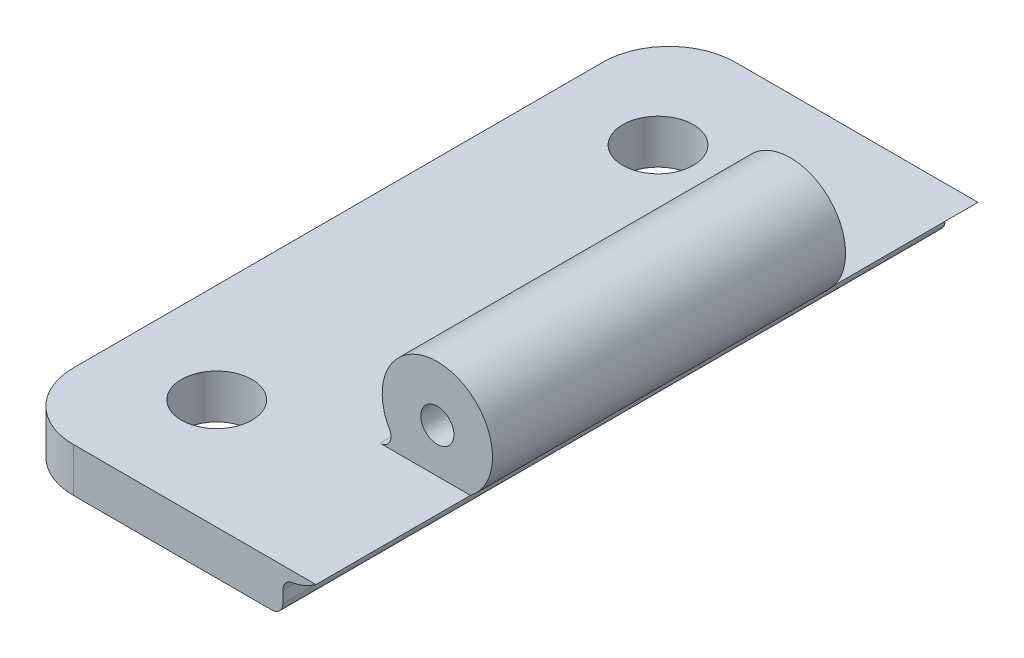
ISO-10303-21;
HEADER;
FILE_DESCRIPTION(('STEP AP214'),'2;1');
FILE_NAME('part.step','',(''),(''),'','','');
FILE_SCHEMA(('AUTOMOTIVE_DESIGN { 1 0 10303 214 1 1 1 1 }'));
ENDSEC;
DATA;
#1=APPLICATION_CONTEXT('core data for automotive mechanical design processes');
#2=APPLICATION_PROTOCOL_DEFINITION('international standard','automotive_design',2000,#1);
#3=PRODUCT_CONTEXT('',#1,'mechanical');
#4=PRODUCT('Part','Part','',(#3));
#5=PRODUCT_RELATED_PRODUCT_CATEGORY('part','',(#4));
#6=PRODUCT_DEFINITION_FORMATION('','',#4);
#7=PRODUCT_DEFINITION_CONTEXT('part definition',#1,'design');
#8=PRODUCT_DEFINITION('design','',#6,#7);
#9=PRODUCT_DEFINITION_SHAPE('','',#8);
#10=(LENGTH_UNIT() NAMED_UNIT(*) SI_UNIT(.MILLI.,.METRE.));
#11=(NAMED_UNIT(*) PLANE_ANGLE_UNIT() SI_UNIT($,.RADIAN.));
#12=(NAMED_UNIT(*) SI_UNIT($,.STERADIAN.) SOLID_ANGLE_UNIT());
#13=UNCERTAINTY_MEASURE_WITH_UNIT(LENGTH_MEASURE(1.E-05),#10,'distance_accuracy_value','');
#14=(GEOMETRIC_REPRESENTATION_CONTEXT(3) GLOBAL_UNCERTAINTY_ASSIGNED_CONTEXT((#13)) GLOBAL_UNIT_ASSIGNED_CONTEXT((#10,
#11,#12)) REPRESENTATION_CONTEXT('',''));
#15=CARTESIAN_POINT('',(0.,0.,0.));
#16=DIRECTION('',(0.,0.,1.));
#17=DIRECTION('',(1.,0.,0.));
#18=AXIS2_PLACEMENT_3D('',#15,#16,#17);
#19=CARTESIAN_POINT('',(3.00000000000002,2.,0.));
#20=DIRECTION('',(0.,0.,1.));
#21=DIRECTION('',(1.,0.,0.));
#22=AXIS2_PLACEMENT_3D('',#19,#20,#21);
#23=PLANE('',#22);
#24=DIRECTION('',(-1.,0.,0.));
#25=VECTOR('',#24,1.);
#26=CARTESIAN_POINT('',(3.00000000000002,2.,0.));
#27=LINE('',#26,#25);
#28=CARTESIAN_POINT('',(14.,2.,0.));
#29=VERTEX_POINT('',#28);
#30=CARTESIAN_POINT('',(3.00000000000002,2.,0.));
#31=VERTEX_POINT('',#30);
#32=EDGE_CURVE('E208',#29,#31,#27,.T.);
#33=ORIENTED_EDGE('',*,*,#32,.F.);
#34=CARTESIAN_POINT('',(12.5,4.,0.));
#35=DIRECTION('',(0.,0.,1.));
#36=DIRECTION('',(1.,0.,0.));
#37=AXIS2_PLACEMENT_3D('',#34,#35,#36);
#38=CIRCLE('',#37,2.5);
#39=CARTESIAN_POINT('',(12.9166666666667,1.53496675704183,0.));
#40=VERTEX_POINT('',#39);
#41=EDGE_CURVE('E193',#29,#40,#38,.F.);
#42=ORIENTED_EDGE('',*,*,#41,.T.);
#43=CARTESIAN_POINT('',(13.,1.04196010845019,0.));
#44=DIRECTION('',(0.,0.,1.));
#45=DIRECTION('',(1.,0.,0.));
#46=AXIS2_PLACEMENT_3D('',#43,#44,#45);
#47=CIRCLE('',#46,0.5);
#48=CARTESIAN_POINT('',(12.5,1.04196010845019,0.));
#49=VERTEX_POINT('',#48);
#50=EDGE_CURVE('E11',#40,#49,#47,.T.);
#51=ORIENTED_EDGE('',*,*,#50,.T.);
#52=DIRECTION('',(0.,-1.,0.));
#53=VECTOR('',#52,1.);
#54=CARTESIAN_POINT('',(12.5,2.,0.));
#55=LINE('',#54,#53);
#56=CARTESIAN_POINT('',(12.5,0.5,0.));
#57=VERTEX_POINT('',#56);
#58=EDGE_CURVE('E242',#49,#57,#55,.T.);
#59=ORIENTED_EDGE('',*,*,#58,.T.);
#60=CARTESIAN_POINT('',(12.,0.5,0.));
#61=DIRECTION('',(0.,0.,1.));
#62=DIRECTION('',(1.,0.,0.));
#63=AXIS2_PLACEMENT_3D('',#60,#61,#62);
#64=CIRCLE('',#63,0.5);
#65=CARTESIAN_POINT('',(12.,0.,0.));
#66=VERTEX_POINT('',#65);
#67=EDGE_CURVE('E169',#57,#66,#64,.F.);
#68=ORIENTED_EDGE('',*,*,#67,.T.);
#69=DIRECTION('',(-1.,0.,0.));
#70=VECTOR('',#69,1.);
#71=CARTESIAN_POINT('',(3.00000000000002,0.,0.));
#72=LINE('',#71,#70);
#73=CARTESIAN_POINT('',(3.00000000000002,0.,0.));
#74=VERTEX_POINT('',#73);
#75=EDGE_CURVE('E205',#66,#74,#72,.T.);
#76=ORIENTED_EDGE('',*,*,#75,.T.);
#77=DIRECTION('',(0.,-1.,0.));
#78=VECTOR('',#77,1.);
#79=CARTESIAN_POINT('',(3.00000000000002,2.,0.));
#80=LINE('',#79,#78);
#81=EDGE_CURVE('E239',#31,#74,#80,.T.);
#82=ORIENTED_EDGE('',*,*,#81,.F.);
#83=EDGE_LOOP('',(#33,#42,#51,#59,#68,#76,#82));
#84=FACE_BOUND('',#83,.T.);
#85=ADVANCED_FACE('F43',(#84),#23,.F.);
#86=CARTESIAN_POINT('',(3.00000000000002,2.,30.));
#87=DIRECTION('',(0.,0.,-1.));
#88=DIRECTION('',(-1.,0.,0.));
#89=AXIS2_PLACEMENT_3D('',#86,#87,#88);
#90=PLANE('',#89);
#91=CARTESIAN_POINT('',(12.5,4.,30.));
#92=DIRECTION('',(0.,0.,1.));
#93=DIRECTION('',(1.,0.,0.));
#94=AXIS2_PLACEMENT_3D('',#91,#92,#93);
#95=CIRCLE('',#94,2.5);
#96=CARTESIAN_POINT('',(12.9166666666667,1.53496675704183,30.));
#97=VERTEX_POINT('',#96);
#98=CARTESIAN_POINT('',(14.,2.,30.));
#99=VERTEX_POINT('',#98);
#100=EDGE_CURVE('E190',#97,#99,#95,.T.);
#101=ORIENTED_EDGE('',*,*,#100,.T.);
#102=DIRECTION('',(1.,0.,0.));
#103=VECTOR('',#102,1.);
#104=CARTESIAN_POINT('',(3.00000000000002,2.,30.));
#105=LINE('',#104,#103);
#106=CARTESIAN_POINT('',(3.00000000000002,2.,30.));
#107=VERTEX_POINT('',#106);
#108=EDGE_CURVE('E217',#107,#99,#105,.T.);
#109=ORIENTED_EDGE('',*,*,#108,.F.);
#110=DIRECTION('',(0.,-1.,0.));
#111=VECTOR('',#110,1.);
#112=CARTESIAN_POINT('',(3.00000000000002,2.,30.));
#113=LINE('',#112,#111);
#114=CARTESIAN_POINT('',(3.00000000000002,0.,30.));
#115=VERTEX_POINT('',#114);
#116=EDGE_CURVE('E230',#107,#115,#113,.T.);
#117=ORIENTED_EDGE('',*,*,#116,.T.);
#118=DIRECTION('',(1.,0.,0.));
#119=VECTOR('',#118,1.);
#120=CARTESIAN_POINT('',(3.00000000000002,0.,30.));
#121=LINE('',#120,#119);
#122=CARTESIAN_POINT('',(12.,0.,30.));
#123=VERTEX_POINT('',#122);
#124=EDGE_CURVE('E211',#115,#123,#121,.T.);
#125=ORIENTED_EDGE('',*,*,#124,.T.);
#126=CARTESIAN_POINT('',(12.,0.5,30.));
#127=DIRECTION('',(0.,0.,-1.));
#128=DIRECTION('',(-1.,0.,0.));
#129=AXIS2_PLACEMENT_3D('',#126,#127,#128);
#130=CIRCLE('',#129,0.5);
#131=CARTESIAN_POINT('',(12.5,0.5,30.));
#132=VERTEX_POINT('',#131);
#133=EDGE_CURVE('E172',#123,#132,#130,.F.);
#134=ORIENTED_EDGE('',*,*,#133,.T.);
#135=DIRECTION('',(0.,-1.,0.));
#136=VECTOR('',#135,1.);
#137=CARTESIAN_POINT('',(12.5,2.,30.));
#138=LINE('',#137,#136);
#139=CARTESIAN_POINT('',(12.5,1.04196010845019,30.));
#140=VERTEX_POINT('',#139);
#141=EDGE_CURVE('E219',#140,#132,#138,.T.);
#142=ORIENTED_EDGE('',*,*,#141,.F.);
#143=CARTESIAN_POINT('',(13.,1.04196010845019,30.));
#144=DIRECTION('',(0.,0.,-1.));
#145=DIRECTION('',(-1.,0.,0.));
#146=AXIS2_PLACEMENT_3D('',#143,#144,#145);
#147=CIRCLE('',#146,0.5);
#148=EDGE_CURVE('E52',#140,#97,#147,.T.);
#149=ORIENTED_EDGE('',*,*,#148,.T.);
#150=EDGE_LOOP('',(#101,#109,#117,#125,#134,#142,#149));
#151=FACE_BOUND('',#150,.T.);
#152=ADVANCED_FACE('F291',(#151),#90,.F.);
#153=CARTESIAN_POINT('',(12.5,4.,-7.07106781186548));
#154=DIRECTION('',(0.,0.,1.));
#155=DIRECTION('',(1.,0.,0.));
#156=AXIS2_PLACEMENT_3D('',#153,#154,#155);
#157=CYLINDRICAL_SURFACE('',#156,2.5);
#158=CARTESIAN_POINT('',(12.5,4.,7.));
#159=DIRECTION('',(0.,0.,-1.));
#160=DIRECTION('',(-1.,0.,0.));
#161=AXIS2_PLACEMENT_3D('',#158,#159,#160);
#162=CIRCLE('',#161,2.5);
#163=CARTESIAN_POINT('',(14.,2.,7.));
#164=VERTEX_POINT('',#163);
#165=CARTESIAN_POINT('',(10.3349364905389,2.75,7.));
#166=VERTEX_POINT('',#165);
#167=EDGE_CURVE('E143',#164,#166,#162,.F.);
#168=ORIENTED_EDGE('',*,*,#167,.T.);
#169=DIRECTION('',(0.,0.,1.));
#170=VECTOR('',#169,1.);
#171=CARTESIAN_POINT('',(10.3349364905389,2.75,-7.07106781186548));
#172=LINE('',#171,#170);
#173=CARTESIAN_POINT('',(10.3349364905389,2.75,23.));
#174=VERTEX_POINT('',#173);
#175=EDGE_CURVE('E154',#166,#174,#172,.T.);
#176=ORIENTED_EDGE('',*,*,#175,.T.);
#177=CARTESIAN_POINT('',(12.5,4.,23.));
#178=DIRECTION('',(0.,0.,1.));
#179=DIRECTION('',(1.,0.,0.));
#180=AXIS2_PLACEMENT_3D('',#177,#178,#179);
#181=CIRCLE('',#180,2.5);
#182=CARTESIAN_POINT('',(14.,2.,23.));
#183=VERTEX_POINT('',#182);
#184=EDGE_CURVE('E178',#174,#183,#181,.F.);
#185=ORIENTED_EDGE('',*,*,#184,.T.);
#186=DIRECTION('',(0.,0.,1.));
#187=VECTOR('',#186,1.);
#188=CARTESIAN_POINT('',(14.,2.,-7.07106781186548));
#189=LINE('',#188,#187);
#190=EDGE_CURVE('E185',#183,#99,#189,.T.);
#191=ORIENTED_EDGE('',*,*,#190,.T.);
#192=ORIENTED_EDGE('',*,*,#100,.F.);
#193=DIRECTION('',(0.,0.,1.));
#194=VECTOR('',#193,1.);
#195=CARTESIAN_POINT('',(12.9166666666667,1.53496675704183,-7.07106781186548));
#196=LINE('',#195,#194);
#197=EDGE_CURVE('E163',#97,#40,#196,.F.);
#198=ORIENTED_EDGE('',*,*,#197,.T.);
#199=ORIENTED_EDGE('',*,*,#41,.F.);
#200=DIRECTION('',(0.,0.,1.));
#201=VECTOR('',#200,1.);
#202=CARTESIAN_POINT('',(14.,2.,-7.07106781186548));
#203=LINE('',#202,#201);
#204=EDGE_CURVE('E188',#29,#164,#203,.T.);
#205=ORIENTED_EDGE('',*,*,#204,.T.);
#206=EDGE_LOOP('',(#168,#176,#185,#191,#192,#198,#199,#205));
#207=FACE_BOUND('',#206,.T.);
#208=ADVANCED_FACE('F250',(#207),#157,.T.);
#209=CARTESIAN_POINT('',(9.90192378864669,2.5,-7.07106781186548));
#210=DIRECTION('',(0.,0.,1.));
#211=DIRECTION('',(1.,0.,0.));
#212=AXIS2_PLACEMENT_3D('',#209,#210,#211);
#213=CYLINDRICAL_SURFACE('',#212,0.5);
#214=CARTESIAN_POINT('',(9.90192378864669,2.5,7.));
#215=DIRECTION('',(0.,0.,-1.));
#216=DIRECTION('',(-1.,0.,0.));
#217=AXIS2_PLACEMENT_3D('',#214,#215,#216);
#218=CIRCLE('',#217,0.5);
#219=CARTESIAN_POINT('',(9.90192378864669,2.,7.));
#220=VERTEX_POINT('',#219);
#221=EDGE_CURVE('E141',#220,#166,#218,.F.);
#222=ORIENTED_EDGE('',*,*,#221,.F.);
#223=DIRECTION('',(0.,0.,-1.));
#224=VECTOR('',#223,1.);
#225=CARTESIAN_POINT('',(9.90192378864669,2.,0.));
#226=LINE('',#225,#224);
#227=CARTESIAN_POINT('',(9.90192378864669,2.,23.));
#228=VERTEX_POINT('',#227);
#229=EDGE_CURVE('E152',#228,#220,#226,.T.);
#230=ORIENTED_EDGE('',*,*,#229,.F.);
#231=CARTESIAN_POINT('',(9.90192378864669,2.5,23.));
#232=DIRECTION('',(0.,0.,1.));
#233=DIRECTION('',(1.,0.,0.));
#234=AXIS2_PLACEMENT_3D('',#231,#232,#233);
#235=CIRCLE('',#234,0.5);
#236=EDGE_CURVE('E175',#174,#228,#235,.F.);
#237=ORIENTED_EDGE('',*,*,#236,.F.);
#238=ORIENTED_EDGE('',*,*,#175,.F.);
#239=EDGE_LOOP('',(#222,#230,#237,#238));
#240=FACE_BOUND('',#239,.T.);
#241=ADVANCED_FACE('F150',(#240),#213,.F.);
#242=CARTESIAN_POINT('',(3.,2.,27.));
#243=DIRECTION('',(0.,1.,0.));
#244=DIRECTION('',(0.,0.,1.));
#245=AXIS2_PLACEMENT_3D('',#242,#243,#244);
#246=PLANE('',#245);
#247=ORIENTED_EDGE('',*,*,#108,.T.);
#248=ORIENTED_EDGE('',*,*,#190,.F.);
#249=DIRECTION('',(-1.,0.,0.));
#250=VECTOR('',#249,1.);
#251=CARTESIAN_POINT('',(9.90192378864669,2.,23.));
#252=LINE('',#251,#250);
#253=EDGE_CURVE('E60',#183,#228,#252,.T.);
#254=ORIENTED_EDGE('',*,*,#253,.T.);
#255=ORIENTED_EDGE('',*,*,#229,.T.);
#256=DIRECTION('',(1.,0.,0.));
#257=VECTOR('',#256,1.);
#258=CARTESIAN_POINT('',(9.90192378864669,2.,7.));
#259=LINE('',#258,#257);
#260=EDGE_CURVE('E137',#220,#164,#259,.T.);
#261=ORIENTED_EDGE('',*,*,#260,.T.);
#262=ORIENTED_EDGE('',*,*,#204,.F.);
#263=ORIENTED_EDGE('',*,*,#32,.T.);
#264=CARTESIAN_POINT('',(3.,2.,3.));
#265=DIRECTION('',(0.,1.,0.));
#266=DIRECTION('',(0.,0.,1.));
#267=AXIS2_PLACEMENT_3D('',#264,#265,#266);
#268=CIRCLE('',#267,3.);
#269=CARTESIAN_POINT('',(0.,2.,3.00000000000002));
#270=VERTEX_POINT('',#269);
#271=EDGE_CURVE('E210',#31,#270,#268,.T.);
#272=ORIENTED_EDGE('',*,*,#271,.T.);
#273=DIRECTION('',(0.,0.,1.));
#274=VECTOR('',#273,1.);
#275=CARTESIAN_POINT('',(0.,2.,3.00000000000002));
#276=LINE('',#275,#274);
#277=CARTESIAN_POINT('',(0.,2.,27.));
#278=VERTEX_POINT('',#277);
#279=EDGE_CURVE('E213',#270,#278,#276,.T.);
#280=ORIENTED_EDGE('',*,*,#279,.T.);
#281=CARTESIAN_POINT('',(3.,2.,27.));
#282=DIRECTION('',(0.,1.,0.));
#283=DIRECTION('',(0.,0.,1.));
#284=AXIS2_PLACEMENT_3D('',#281,#282,#283);
#285=CIRCLE('',#284,3.);
#286=EDGE_CURVE('E215',#278,#107,#285,.T.);
#287=ORIENTED_EDGE('',*,*,#286,.T.);
#288=EDGE_LOOP('',(#247,#248,#254,#255,#261,#262,#263,#272,#280,#287));
#289=FACE_BOUND('',#288,.T.);
#290=CARTESIAN_POINT('',(4.5,2.,5.));
#291=DIRECTION('',(0.,1.,0.));
#292=DIRECTION('',(0.,0.,1.));
#293=AXIS2_PLACEMENT_3D('',#290,#291,#292);
#294=CIRCLE('',#293,1.6);
#295=CARTESIAN_POINT('',(4.5,2.,6.6));
#296=VERTEX_POINT('',#295);
#297=EDGE_CURVE('E202',#296,#296,#294,.T.);
#298=ORIENTED_EDGE('',*,*,#297,.F.);
#299=EDGE_LOOP('',(#298));
#300=FACE_BOUND('',#299,.T.);
#301=CARTESIAN_POINT('',(4.5,2.,25.));
#302=DIRECTION('',(0.,1.,0.));
#303=DIRECTION('',(0.,0.,1.));
#304=AXIS2_PLACEMENT_3D('',#301,#302,#303);
#305=CIRCLE('',#304,1.6);
#306=CARTESIAN_POINT('',(4.5,2.,26.6));
#307=VERTEX_POINT('',#306);
#308=EDGE_CURVE('E196',#307,#307,#305,.T.);
#309=ORIENTED_EDGE('',*,*,#308,.F.);
#310=EDGE_LOOP('',(#309));
#311=FACE_BOUND('',#310,.T.);
#312=ADVANCED_FACE('F156',(#289,#300,#311),#246,.T.);
#313=CARTESIAN_POINT('',(3.,0.,27.));
#314=DIRECTION('',(0.,1.,0.));
#315=DIRECTION('',(0.,0.,1.));
#316=AXIS2_PLACEMENT_3D('',#313,#314,#315);
#317=PLANE('',#316);
#318=ORIENTED_EDGE('',*,*,#75,.F.);
#319=DIRECTION('',(0.,0.,-1.));
#320=VECTOR('',#319,1.);
#321=CARTESIAN_POINT('',(12.,0.,27.));
#322=LINE('',#321,#320);
#323=EDGE_CURVE('E68',#66,#123,#322,.F.);
#324=ORIENTED_EDGE('',*,*,#323,.T.);
#325=ORIENTED_EDGE('',*,*,#124,.F.);
#326=CARTESIAN_POINT('',(3.,0.,27.));
#327=DIRECTION('',(0.,1.,0.));
#328=DIRECTION('',(0.,0.,1.));
#329=AXIS2_PLACEMENT_3D('',#326,#327,#328);
#330=CIRCLE('',#329,3.);
#331=CARTESIAN_POINT('',(0.,0.,27.));
#332=VERTEX_POINT('',#331);
#333=EDGE_CURVE('E225',#332,#115,#330,.T.);
#334=ORIENTED_EDGE('',*,*,#333,.F.);
#335=DIRECTION('',(0.,0.,1.));
#336=VECTOR('',#335,1.);
#337=CARTESIAN_POINT('',(0.,0.,3.00000000000002));
#338=LINE('',#337,#336);
#339=CARTESIAN_POINT('',(0.,0.,3.00000000000002));
#340=VERTEX_POINT('',#339);
#341=EDGE_CURVE('E223',#340,#332,#338,.T.);
#342=ORIENTED_EDGE('',*,*,#341,.F.);
#343=CARTESIAN_POINT('',(3.,0.,3.));
#344=DIRECTION('',(0.,1.,0.));
#345=DIRECTION('',(0.,0.,1.));
#346=AXIS2_PLACEMENT_3D('',#343,#344,#345);
#347=CIRCLE('',#346,3.);
#348=EDGE_CURVE('E221',#74,#340,#347,.T.);
#349=ORIENTED_EDGE('',*,*,#348,.F.);
#350=EDGE_LOOP('',(#318,#324,#325,#334,#342,#349));
#351=FACE_BOUND('',#350,.T.);
#352=CARTESIAN_POINT('',(4.5,0.,5.));
#353=DIRECTION('',(0.,1.,0.));
#354=DIRECTION('',(0.,0.,1.));
#355=AXIS2_PLACEMENT_3D('',#352,#353,#354);
#356=CIRCLE('',#355,1.6);
#357=CARTESIAN_POINT('',(4.5,0.,6.6));
#358=VERTEX_POINT('',#357);
#359=EDGE_CURVE('E199',#358,#358,#356,.T.);
#360=ORIENTED_EDGE('',*,*,#359,.T.);
#361=EDGE_LOOP('',(#360));
#362=FACE_BOUND('',#361,.T.);
#363=CARTESIAN_POINT('',(4.5,0.,25.));
#364=DIRECTION('',(0.,1.,0.));
#365=DIRECTION('',(0.,0.,1.));
#366=AXIS2_PLACEMENT_3D('',#363,#364,#365);
#367=CIRCLE('',#366,1.6);
#368=CARTESIAN_POINT('',(4.5,0.,26.6));
#369=VERTEX_POINT('',#368);
#370=EDGE_CURVE('E195',#369,#369,#367,.T.);
#371=ORIENTED_EDGE('',*,*,#370,.T.);
#372=EDGE_LOOP('',(#371));
#373=FACE_BOUND('',#372,.T.);
#374=ADVANCED_FACE('F264',(#351,#362,#373),#317,.F.);
#375=CARTESIAN_POINT('',(12.5,2.,0.));
#376=DIRECTION('',(-1.,0.,0.));
#377=DIRECTION('',(0.,0.,1.));
#378=AXIS2_PLACEMENT_3D('',#375,#376,#377);
#379=PLANE('',#378);
#380=ORIENTED_EDGE('',*,*,#141,.T.);
#381=DIRECTION('',(0.,0.,-1.));
#382=VECTOR('',#381,1.);
#383=CARTESIAN_POINT('',(12.5,0.5,0.));
#384=LINE('',#383,#382);
#385=EDGE_CURVE('E161',#132,#57,#384,.T.);
#386=ORIENTED_EDGE('',*,*,#385,.T.);
#387=ORIENTED_EDGE('',*,*,#58,.F.);
#388=DIRECTION('',(0.,0.,1.));
#389=VECTOR('',#388,1.);
#390=CARTESIAN_POINT('',(12.5,1.04196010845019,0.));
#391=LINE('',#390,#389);
#392=EDGE_CURVE('E158',#49,#140,#391,.T.);
#393=ORIENTED_EDGE('',*,*,#392,.T.);
#394=EDGE_LOOP('',(#380,#386,#387,#393));
#395=FACE_BOUND('',#394,.T.);
#396=ADVANCED_FACE('F256',(#395),#379,.F.);
#397=CARTESIAN_POINT('',(3.,2.,3.));
#398=DIRECTION('',(0.,-1.,0.));
#399=DIRECTION('',(0.,0.,-1.));
#400=AXIS2_PLACEMENT_3D('',#397,#398,#399);
#401=CYLINDRICAL_SURFACE('',#400,3.);
#402=ORIENTED_EDGE('',*,*,#348,.T.);
#403=DIRECTION('',(0.,-1.,0.));
#404=VECTOR('',#403,1.);
#405=CARTESIAN_POINT('',(0.,2.,3.00000000000002));
#406=LINE('',#405,#404);
#407=EDGE_CURVE('E236',#270,#340,#406,.T.);
#408=ORIENTED_EDGE('',*,*,#407,.F.);
#409=ORIENTED_EDGE('',*,*,#271,.F.);
#410=ORIENTED_EDGE('',*,*,#81,.T.);
#411=EDGE_LOOP('',(#402,#408,#409,#410));
#412=FACE_BOUND('',#411,.T.);
#413=ADVANCED_FACE('F270',(#412),#401,.T.);
#414=CARTESIAN_POINT('',(0.,2.,3.00000000000002));
#415=DIRECTION('',(1.,0.,0.));
#416=DIRECTION('',(0.,0.,-1.));
#417=AXIS2_PLACEMENT_3D('',#414,#415,#416);
#418=PLANE('',#417);
#419=ORIENTED_EDGE('',*,*,#341,.T.);
#420=DIRECTION('',(0.,-1.,0.));
#421=VECTOR('',#420,1.);
#422=CARTESIAN_POINT('',(0.,2.,27.));
#423=LINE('',#422,#421);
#424=EDGE_CURVE('E233',#278,#332,#423,.T.);
#425=ORIENTED_EDGE('',*,*,#424,.F.);
#426=ORIENTED_EDGE('',*,*,#279,.F.);
#427=ORIENTED_EDGE('',*,*,#407,.T.);
#428=EDGE_LOOP('',(#419,#425,#426,#427));
#429=FACE_BOUND('',#428,.T.);
#430=ADVANCED_FACE('F274',(#429),#418,.F.);
#431=CARTESIAN_POINT('',(3.,2.,27.));
#432=DIRECTION('',(0.,-1.,0.));
#433=DIRECTION('',(0.,0.,-1.));
#434=AXIS2_PLACEMENT_3D('',#431,#432,#433);
#435=CYLINDRICAL_SURFACE('',#434,3.);
#436=ORIENTED_EDGE('',*,*,#333,.T.);
#437=ORIENTED_EDGE('',*,*,#116,.F.);
#438=ORIENTED_EDGE('',*,*,#286,.F.);
#439=ORIENTED_EDGE('',*,*,#424,.T.);
#440=EDGE_LOOP('',(#436,#437,#438,#439));
#441=FACE_BOUND('',#440,.T.);
#442=ADVANCED_FACE('F316',(#441),#435,.T.);
#443=CARTESIAN_POINT('',(4.5,2.,5.));
#444=DIRECTION('',(0.,-1.,0.));
#445=DIRECTION('',(0.,0.,-1.));
#446=AXIS2_PLACEMENT_3D('',#443,#444,#445);
#447=CYLINDRICAL_SURFACE('',#446,1.6);
#448=ORIENTED_EDGE('',*,*,#297,.T.);
#449=EDGE_LOOP('',(#448));
#450=FACE_BOUND('',#449,.T.);
#451=ORIENTED_EDGE('',*,*,#359,.F.);
#452=EDGE_LOOP('',(#451));
#453=FACE_BOUND('',#452,.T.);
#454=ADVANCED_FACE('F309',(#450,#453),#447,.F.);
#455=CARTESIAN_POINT('',(4.5,2.,25.));
#456=DIRECTION('',(0.,-1.,0.));
#457=DIRECTION('',(0.,0.,-1.));
#458=AXIS2_PLACEMENT_3D('',#455,#456,#457);
#459=CYLINDRICAL_SURFACE('',#458,1.6);
#460=ORIENTED_EDGE('',*,*,#308,.T.);
#461=EDGE_LOOP('',(#460));
#462=FACE_BOUND('',#461,.T.);
#463=ORIENTED_EDGE('',*,*,#370,.F.);
#464=EDGE_LOOP('',(#463));
#465=FACE_BOUND('',#464,.T.);
#466=ADVANCED_FACE('F305',(#462,#465),#459,.F.);
#467=CARTESIAN_POINT('',(12.,0.5,0.));
#468=DIRECTION('',(0.,0.,-1.));
#469=DIRECTION('',(-1.,0.,0.));
#470=AXIS2_PLACEMENT_3D('',#467,#468,#469);
#471=CYLINDRICAL_SURFACE('',#470,0.5);
#472=ORIENTED_EDGE('',*,*,#133,.F.);
#473=ORIENTED_EDGE('',*,*,#323,.F.);
#474=ORIENTED_EDGE('',*,*,#67,.F.);
#475=ORIENTED_EDGE('',*,*,#385,.F.);
#476=EDGE_LOOP('',(#472,#473,#474,#475));
#477=FACE_BOUND('',#476,.T.);
#478=ADVANCED_FACE('F261',(#477),#471,.T.);
#479=CARTESIAN_POINT('',(13.,1.04196010845019,-7.07106781186548));
#480=DIRECTION('',(0.,0.,1.));
#481=DIRECTION('',(1.,0.,0.));
#482=AXIS2_PLACEMENT_3D('',#479,#480,#481);
#483=CYLINDRICAL_SURFACE('',#482,0.5);
#484=ORIENTED_EDGE('',*,*,#50,.F.);
#485=ORIENTED_EDGE('',*,*,#197,.F.);
#486=ORIENTED_EDGE('',*,*,#148,.F.);
#487=ORIENTED_EDGE('',*,*,#392,.F.);
#488=EDGE_LOOP('',(#484,#485,#486,#487));
#489=FACE_BOUND('',#488,.T.);
#490=ADVANCED_FACE('F45',(#489),#483,.F.);
#491=CARTESIAN_POINT('',(9.90192378864669,6.5,23.));
#492=DIRECTION('',(0.,0.,1.));
#493=DIRECTION('',(1.,0.,0.));
#494=AXIS2_PLACEMENT_3D('',#491,#492,#493);
#495=PLANE('',#494);
#496=ORIENTED_EDGE('',*,*,#184,.F.);
#497=ORIENTED_EDGE('',*,*,#236,.T.);
#498=ORIENTED_EDGE('',*,*,#253,.F.);
#499=EDGE_LOOP('',(#496,#497,#498));
#500=FACE_BOUND('',#499,.T.);
#501=CARTESIAN_POINT('',(12.5,4.,23.));
#502=DIRECTION('',(0.,0.,1.));
#503=DIRECTION('',(1.,0.,0.));
#504=AXIS2_PLACEMENT_3D('',#501,#502,#503);
#505=CIRCLE('',#504,0.75);
#506=CARTESIAN_POINT('',(13.25,4.,23.));
#507=VERTEX_POINT('',#506);
#508=EDGE_CURVE('E146',#507,#507,#505,.F.);
#509=ORIENTED_EDGE('',*,*,#508,.T.);
#510=EDGE_LOOP('',(#509));
#511=FACE_BOUND('',#510,.T.);
#512=ADVANCED_FACE('F279',(#500,#511),#495,.T.);
#513=CARTESIAN_POINT('',(9.90192378864669,6.5,7.));
#514=DIRECTION('',(0.,0.,-1.));
#515=DIRECTION('',(-1.,0.,0.));
#516=AXIS2_PLACEMENT_3D('',#513,#514,#515);
#517=PLANE('',#516);
#518=ORIENTED_EDGE('',*,*,#260,.F.);
#519=ORIENTED_EDGE('',*,*,#221,.T.);
#520=ORIENTED_EDGE('',*,*,#167,.F.);
#521=EDGE_LOOP('',(#518,#519,#520));
#522=FACE_BOUND('',#521,.T.);
#523=CARTESIAN_POINT('',(12.5,4.,7.));
#524=DIRECTION('',(0.,0.,-1.));
#525=DIRECTION('',(-1.,0.,0.));
#526=AXIS2_PLACEMENT_3D('',#523,#524,#525);
#527=CIRCLE('',#526,0.75);
#528=CARTESIAN_POINT('',(11.75,4.,7.));
#529=VERTEX_POINT('',#528);
#530=EDGE_CURVE('E47',#529,#529,#527,.F.);
#531=ORIENTED_EDGE('',*,*,#530,.T.);
#532=EDGE_LOOP('',(#531));
#533=FACE_BOUND('',#532,.T.);
#534=ADVANCED_FACE('F139',(#522,#533),#517,.T.);
#535=CARTESIAN_POINT('',(12.5,4.,0.));
#536=DIRECTION('',(0.,0.,1.));
#537=DIRECTION('',(1.,0.,0.));
#538=AXIS2_PLACEMENT_3D('',#535,#536,#537);
#539=CYLINDRICAL_SURFACE('',#538,0.75);
#540=ORIENTED_EDGE('',*,*,#508,.F.);
#541=EDGE_LOOP('',(#540));
#542=FACE_BOUND('',#541,.T.);
#543=ORIENTED_EDGE('',*,*,#530,.F.);
#544=EDGE_LOOP('',(#543));
#545=FACE_BOUND('',#544,.T.);
#546=ADVANCED_FACE('F286',(#542,#545),#539,.F.);
#547=CLOSED_SHELL('',(#85,#152,#208,#241,#312,#374,#396,#413,#430,#442,#454,#466,#478,#490,#512,
#534,#546));
#548=MANIFOLD_SOLID_BREP('B2',#547);
#549=ADVANCED_BREP_SHAPE_REPRESENTATION('',(#18,#548),#14);
#550=SHAPE_DEFINITION_REPRESENTATION(#9,#549);
ENDSEC;
END-ISO-10303-21;
